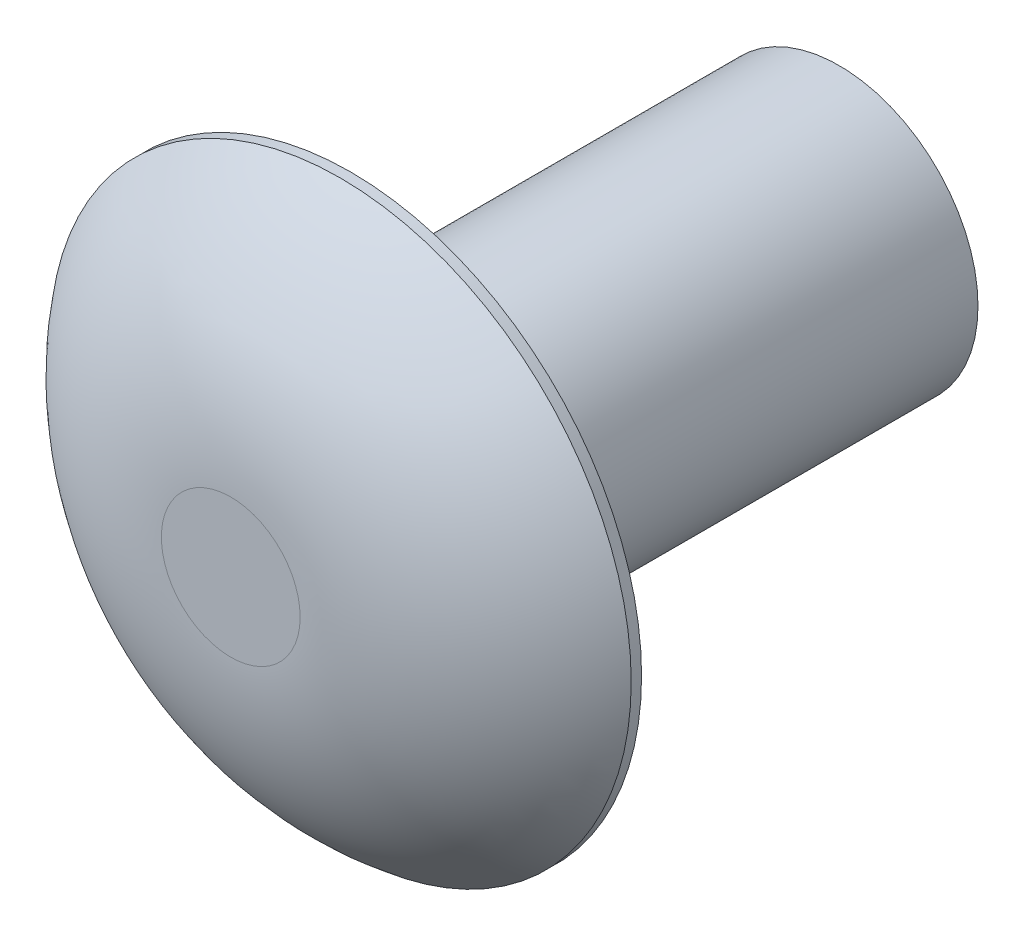
ISO-10303-21;
HEADER;
FILE_DESCRIPTION(('STEP AP214'),'2;1');
FILE_NAME('part.step','',(''),(''),'','','');
FILE_SCHEMA(('AUTOMOTIVE_DESIGN { 1 0 10303 214 1 1 1 1 }'));
ENDSEC;
DATA;
#1=APPLICATION_CONTEXT('core data for automotive mechanical design processes');
#2=APPLICATION_PROTOCOL_DEFINITION('international standard','automotive_design',2000,#1);
#3=PRODUCT_CONTEXT('',#1,'mechanical');
#4=PRODUCT('Part','Part','',(#3));
#5=PRODUCT_RELATED_PRODUCT_CATEGORY('part','',(#4));
#6=PRODUCT_DEFINITION_FORMATION('','',#4);
#7=PRODUCT_DEFINITION_CONTEXT('part definition',#1,'design');
#8=PRODUCT_DEFINITION('design','',#6,#7);
#9=PRODUCT_DEFINITION_SHAPE('','',#8);
#10=(LENGTH_UNIT() NAMED_UNIT(*) SI_UNIT(.MILLI.,.METRE.));
#11=(NAMED_UNIT(*) PLANE_ANGLE_UNIT() SI_UNIT($,.RADIAN.));
#12=(NAMED_UNIT(*) SI_UNIT($,.STERADIAN.) SOLID_ANGLE_UNIT());
#13=UNCERTAINTY_MEASURE_WITH_UNIT(LENGTH_MEASURE(1.E-05),#10,'distance_accuracy_value','');
#14=(GEOMETRIC_REPRESENTATION_CONTEXT(3) GLOBAL_UNCERTAINTY_ASSIGNED_CONTEXT((#13)) GLOBAL_UNIT_ASSIGNED_CONTEXT((#10,
#11,#12)) REPRESENTATION_CONTEXT('',''));
#15=CARTESIAN_POINT('',(0.,0.,0.));
#16=DIRECTION('',(0.,0.,1.));
#17=DIRECTION('',(1.,0.,0.));
#18=AXIS2_PLACEMENT_3D('',#15,#16,#17);
#19=CARTESIAN_POINT('',(0.,2.24506403026729,-8.382));
#20=DIRECTION('',(0.,0.,1.));
#21=DIRECTION('',(1.,0.,0.));
#22=AXIS2_PLACEMENT_3D('',#19,#20,#21);
#23=PLANE('',#22);
#24=CARTESIAN_POINT('',(0.,0.,-8.382));
#25=DIRECTION('',(0.,0.,1.));
#26=DIRECTION('',(1.,0.,0.));
#27=AXIS2_PLACEMENT_3D('',#24,#25,#26);
#28=CIRCLE('',#27,2.38125);
#29=CARTESIAN_POINT('',(2.38125,0.,-8.382));
#30=VERTEX_POINT('',#29);
#31=EDGE_CURVE('E52',#30,#30,#28,.T.);
#32=ORIENTED_EDGE('',*,*,#31,.F.);
#33=EDGE_LOOP('',(#32));
#34=FACE_BOUND('',#33,.T.);
#35=ADVANCED_FACE('F41',(#34),#23,.F.);
#36=CARTESIAN_POINT('',(0.,0.,18.8214));
#37=DIRECTION('',(0.,0.,1.));
#38=DIRECTION('',(1.,0.,0.));
#39=AXIS2_PLACEMENT_3D('',#36,#37,#38);
#40=CYLINDRICAL_SURFACE('',#39,2.38125);
#41=CARTESIAN_POINT('',(0.,0.,-0.254000000000001));
#42=DIRECTION('',(0.,0.,1.));
#43=DIRECTION('',(1.,0.,0.));
#44=AXIS2_PLACEMENT_3D('',#41,#42,#43);
#45=CIRCLE('',#44,2.38125);
#46=CARTESIAN_POINT('',(2.38125,0.,-0.254000000000001));
#47=VERTEX_POINT('',#46);
#48=EDGE_CURVE('E10',#47,#47,#45,.F.);
#49=ORIENTED_EDGE('',*,*,#48,.T.);
#50=EDGE_LOOP('',(#49));
#51=FACE_BOUND('',#50,.T.);
#52=ORIENTED_EDGE('',*,*,#31,.T.);
#53=EDGE_LOOP('',(#52));
#54=FACE_BOUND('',#53,.T.);
#55=ADVANCED_FACE('F84',(#51,#54),#40,.T.);
#56=CARTESIAN_POINT('',(0.,2.38125,0.));
#57=DIRECTION('',(0.,0.,1.));
#58=DIRECTION('',(1.,0.,0.));
#59=AXIS2_PLACEMENT_3D('',#56,#57,#58);
#60=PLANE('',#59);
#61=CARTESIAN_POINT('',(0.,0.,0.));
#62=DIRECTION('',(0.,0.,1.));
#63=DIRECTION('',(1.,0.,0.));
#64=AXIS2_PLACEMENT_3D('',#61,#62,#63);
#65=CIRCLE('',#64,2.63525);
#66=CARTESIAN_POINT('',(2.63525,0.,0.));
#67=VERTEX_POINT('',#66);
#68=EDGE_CURVE('E48',#67,#67,#65,.T.);
#69=ORIENTED_EDGE('',*,*,#68,.T.);
#70=EDGE_LOOP('',(#69));
#71=FACE_BOUND('',#70,.T.);
#72=CARTESIAN_POINT('',(0.,0.,0.));
#73=DIRECTION('',(0.,0.,1.));
#74=DIRECTION('',(1.,0.,0.));
#75=AXIS2_PLACEMENT_3D('',#72,#73,#74);
#76=CIRCLE('',#75,4.9911);
#77=CARTESIAN_POINT('',(4.9911,0.,0.));
#78=VERTEX_POINT('',#77);
#79=EDGE_CURVE('E56',#78,#78,#76,.T.);
#80=ORIENTED_EDGE('',*,*,#79,.F.);
#81=EDGE_LOOP('',(#80));
#82=FACE_BOUND('',#81,.T.);
#83=ADVANCED_FACE('F79',(#71,#82),#60,.F.);
#84=CARTESIAN_POINT('',(0.,0.,18.8214));
#85=DIRECTION('',(0.,0.,1.));
#86=DIRECTION('',(1.,0.,0.));
#87=AXIS2_PLACEMENT_3D('',#84,#85,#86);
#88=CYLINDRICAL_SURFACE('',#87,4.9911);
#89=CARTESIAN_POINT('',(0.,0.,0.177799999999999));
#90=DIRECTION('',(0.,0.,1.));
#91=DIRECTION('',(1.,0.,0.));
#92=AXIS2_PLACEMENT_3D('',#89,#90,#91);
#93=CIRCLE('',#92,4.9911);
#94=CARTESIAN_POINT('',(4.9911,0.,0.177799999999999));
#95=VERTEX_POINT('',#94);
#96=EDGE_CURVE('E61',#95,#95,#93,.T.);
#97=ORIENTED_EDGE('',*,*,#96,.F.);
#98=EDGE_LOOP('',(#97));
#99=FACE_BOUND('',#98,.T.);
#100=ORIENTED_EDGE('',*,*,#79,.T.);
#101=EDGE_LOOP('',(#100));
#102=FACE_BOUND('',#101,.T.);
#103=ADVANCED_FACE('F73',(#99,#102),#88,.T.);
#104=CARTESIAN_POINT('',(0.,0.,-2.72460318834459));
#105=DIRECTION('',(0.,0.,1.));
#106=DIRECTION('',(1.,0.,0.));
#107=AXIS2_PLACEMENT_3D('',#104,#105,#106);
#108=DEGENERATE_TOROIDAL_SURFACE('',#107,1.190625,4.78200318834459,.T.);
#109=CARTESIAN_POINT('',(0.,0.,2.0574));
#110=DIRECTION('',(0.,0.,1.));
#111=DIRECTION('',(1.,0.,0.));
#112=AXIS2_PLACEMENT_3D('',#109,#110,#111);
#113=CIRCLE('',#112,1.190625);
#114=CARTESIAN_POINT('',(1.190625,0.,2.0574));
#115=VERTEX_POINT('',#114);
#116=EDGE_CURVE('E64',#115,#115,#113,.T.);
#117=ORIENTED_EDGE('',*,*,#116,.F.);
#118=EDGE_LOOP('',(#117));
#119=FACE_BOUND('',#118,.T.);
#120=ORIENTED_EDGE('',*,*,#96,.T.);
#121=EDGE_LOOP('',(#120));
#122=FACE_BOUND('',#121,.T.);
#123=ADVANCED_FACE('F70',(#119,#122),#108,.T.);
#124=CARTESIAN_POINT('',(0.,0.,-0.254000000000001));
#125=DIRECTION('',(0.,0.,1.));
#126=DIRECTION('',(1.,0.,0.));
#127=AXIS2_PLACEMENT_3D('',#124,#125,#126);
#128=TOROIDAL_SURFACE('',#127,2.63525,0.254);
#129=ORIENTED_EDGE('',*,*,#48,.F.);
#130=EDGE_LOOP('',(#129));
#131=FACE_BOUND('',#130,.T.);
#132=ORIENTED_EDGE('',*,*,#68,.F.);
#133=EDGE_LOOP('',(#132));
#134=FACE_BOUND('',#133,.T.);
#135=ADVANCED_FACE('F43',(#131,#134),#128,.F.);
#136=CARTESIAN_POINT('',(-1.190625,-4.9911,2.0574));
#137=DIRECTION('',(0.,0.,-1.));
#138=DIRECTION('',(-1.,0.,0.));
#139=AXIS2_PLACEMENT_3D('',#136,#137,#138);
#140=PLANE('',#139);
#141=ORIENTED_EDGE('',*,*,#116,.T.);
#142=EDGE_LOOP('',(#141));
#143=FACE_BOUND('',#142,.T.);
#144=ADVANCED_FACE('F68',(#143),#140,.F.);
#145=CLOSED_SHELL('',(#35,#55,#83,#103,#123,#135,#144));
#146=MANIFOLD_SOLID_BREP('B2',#145);
#147=ADVANCED_BREP_SHAPE_REPRESENTATION('',(#18,#146),#14);
#148=SHAPE_DEFINITION_REPRESENTATION(#9,#147);
ENDSEC;
END-ISO-10303-21;
